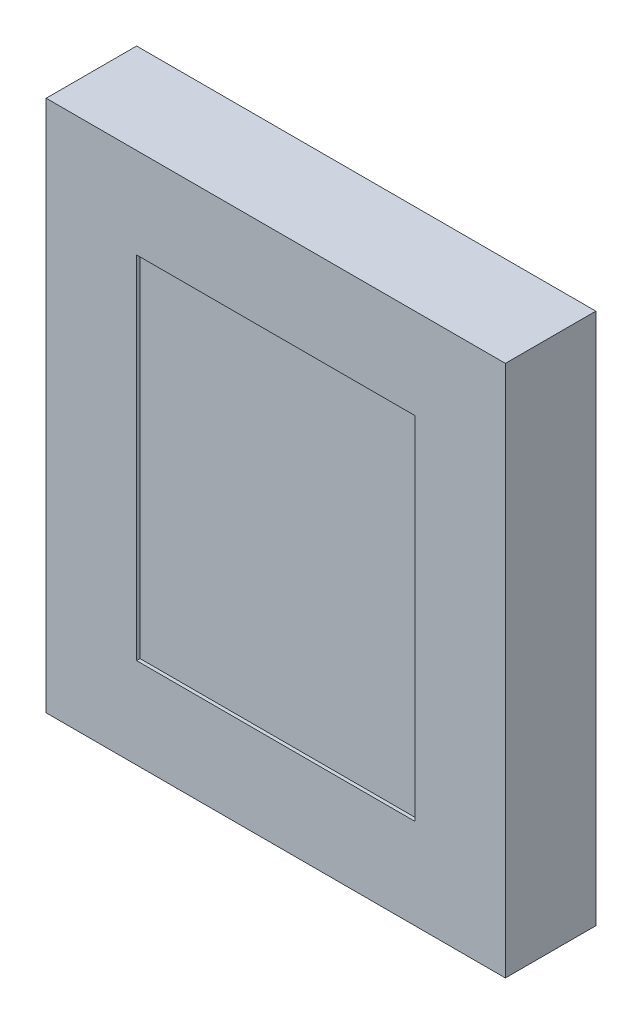
ISO-10303-21;
HEADER;
FILE_DESCRIPTION(('STEP AP214'),'2;1');
FILE_NAME('part.step','',(''),(''),'','','');
FILE_SCHEMA(('AUTOMOTIVE_DESIGN { 1 0 10303 214 1 1 1 1 }'));
ENDSEC;
DATA;
#1=APPLICATION_CONTEXT('core data for automotive mechanical design processes');
#2=APPLICATION_PROTOCOL_DEFINITION('international standard','automotive_design',2000,#1);
#3=PRODUCT_CONTEXT('',#1,'mechanical');
#4=PRODUCT('Part','Part','',(#3));
#5=PRODUCT_RELATED_PRODUCT_CATEGORY('part','',(#4));
#6=PRODUCT_DEFINITION_FORMATION('','',#4);
#7=PRODUCT_DEFINITION_CONTEXT('part definition',#1,'design');
#8=PRODUCT_DEFINITION('design','',#6,#7);
#9=PRODUCT_DEFINITION_SHAPE('','',#8);
#10=(LENGTH_UNIT() NAMED_UNIT(*) SI_UNIT(.MILLI.,.METRE.));
#11=(NAMED_UNIT(*) PLANE_ANGLE_UNIT() SI_UNIT($,.RADIAN.));
#12=(NAMED_UNIT(*) SI_UNIT($,.STERADIAN.) SOLID_ANGLE_UNIT());
#13=UNCERTAINTY_MEASURE_WITH_UNIT(LENGTH_MEASURE(1.E-05),#10,'distance_accuracy_value','');
#14=(GEOMETRIC_REPRESENTATION_CONTEXT(3) GLOBAL_UNCERTAINTY_ASSIGNED_CONTEXT((#13)) GLOBAL_UNIT_ASSIGNED_CONTEXT((#10,
#11,#12)) REPRESENTATION_CONTEXT('',''));
#15=CARTESIAN_POINT('',(0.,0.,0.));
#16=DIRECTION('',(0.,0.,1.));
#17=DIRECTION('',(1.,0.,0.));
#18=AXIS2_PLACEMENT_3D('',#15,#16,#17);
#19=CARTESIAN_POINT('',(330.,382.5,-65.));
#20=DIRECTION('',(0.,1.,0.));
#21=DIRECTION('',(0.,0.,1.));
#22=AXIS2_PLACEMENT_3D('',#19,#20,#21);
#23=PLANE('',#22);
#24=DIRECTION('',(0.,0.,1.));
#25=VECTOR('',#24,1.);
#26=CARTESIAN_POINT('',(-330.,382.5,-65.));
#27=LINE('',#26,#25);
#28=CARTESIAN_POINT('',(-330.,382.5,-65.));
#29=VERTEX_POINT('',#28);
#30=CARTESIAN_POINT('',(-330.,382.5,65.));
#31=VERTEX_POINT('',#30);
#32=EDGE_CURVE('E62',#29,#31,#27,.T.);
#33=ORIENTED_EDGE('',*,*,#32,.T.);
#34=DIRECTION('',(-1.,0.,0.));
#35=VECTOR('',#34,1.);
#36=CARTESIAN_POINT('',(330.,382.5,65.));
#37=LINE('',#36,#35);
#38=CARTESIAN_POINT('',(330.,382.5,65.));
#39=VERTEX_POINT('',#38);
#40=EDGE_CURVE('E160',#39,#31,#37,.T.);
#41=ORIENTED_EDGE('',*,*,#40,.F.);
#42=DIRECTION('',(0.,0.,1.));
#43=VECTOR('',#42,1.);
#44=CARTESIAN_POINT('',(330.,382.5,-65.));
#45=LINE('',#44,#43);
#46=CARTESIAN_POINT('',(330.,382.5,-65.));
#47=VERTEX_POINT('',#46);
#48=EDGE_CURVE('E12',#47,#39,#45,.T.);
#49=ORIENTED_EDGE('',*,*,#48,.F.);
#50=DIRECTION('',(-1.,0.,0.));
#51=VECTOR('',#50,1.);
#52=CARTESIAN_POINT('',(330.,382.5,-65.));
#53=LINE('',#52,#51);
#54=EDGE_CURVE('E188',#47,#29,#53,.T.);
#55=ORIENTED_EDGE('',*,*,#54,.T.);
#56=EDGE_LOOP('',(#33,#41,#49,#55));
#57=FACE_BOUND('',#56,.T.);
#58=ADVANCED_FACE('F59',(#57),#23,.T.);
#59=CARTESIAN_POINT('',(330.,-382.5,-65.));
#60=DIRECTION('',(1.,0.,0.));
#61=DIRECTION('',(0.,1.,0.));
#62=AXIS2_PLACEMENT_3D('',#59,#60,#61);
#63=PLANE('',#62);
#64=ORIENTED_EDGE('',*,*,#48,.T.);
#65=DIRECTION('',(0.,1.,0.));
#66=VECTOR('',#65,1.);
#67=CARTESIAN_POINT('',(330.,-382.5,65.));
#68=LINE('',#67,#66);
#69=CARTESIAN_POINT('',(330.,-382.5,65.));
#70=VERTEX_POINT('',#69);
#71=EDGE_CURVE('E172',#70,#39,#68,.T.);
#72=ORIENTED_EDGE('',*,*,#71,.F.);
#73=DIRECTION('',(0.,0.,1.));
#74=VECTOR('',#73,1.);
#75=CARTESIAN_POINT('',(330.,-382.5,-65.));
#76=LINE('',#75,#74);
#77=CARTESIAN_POINT('',(330.,-382.5,-65.));
#78=VERTEX_POINT('',#77);
#79=EDGE_CURVE('E68',#78,#70,#76,.T.);
#80=ORIENTED_EDGE('',*,*,#79,.F.);
#81=DIRECTION('',(0.,1.,0.));
#82=VECTOR('',#81,1.);
#83=CARTESIAN_POINT('',(330.,-382.5,-65.));
#84=LINE('',#83,#82);
#85=EDGE_CURVE('E204',#78,#47,#84,.T.);
#86=ORIENTED_EDGE('',*,*,#85,.T.);
#87=EDGE_LOOP('',(#64,#72,#80,#86));
#88=FACE_BOUND('',#87,.T.);
#89=ADVANCED_FACE('F220',(#88),#63,.T.);
#90=CARTESIAN_POINT('',(-330.,-382.5,-65.));
#91=DIRECTION('',(0.,-1.,0.));
#92=DIRECTION('',(0.,0.,-1.));
#93=AXIS2_PLACEMENT_3D('',#90,#91,#92);
#94=PLANE('',#93);
#95=ORIENTED_EDGE('',*,*,#79,.T.);
#96=DIRECTION('',(1.,0.,0.));
#97=VECTOR('',#96,1.);
#98=CARTESIAN_POINT('',(-330.,-382.5,65.));
#99=LINE('',#98,#97);
#100=CARTESIAN_POINT('',(-330.,-382.5,65.));
#101=VERTEX_POINT('',#100);
#102=EDGE_CURVE('E168',#101,#70,#99,.T.);
#103=ORIENTED_EDGE('',*,*,#102,.F.);
#104=DIRECTION('',(0.,0.,1.));
#105=VECTOR('',#104,1.);
#106=CARTESIAN_POINT('',(-330.,-382.5,-65.));
#107=LINE('',#106,#105);
#108=CARTESIAN_POINT('',(-330.,-382.5,-65.));
#109=VERTEX_POINT('',#108);
#110=EDGE_CURVE('E209',#109,#101,#107,.T.);
#111=ORIENTED_EDGE('',*,*,#110,.F.);
#112=DIRECTION('',(1.,0.,0.));
#113=VECTOR('',#112,1.);
#114=CARTESIAN_POINT('',(-330.,-382.5,-65.));
#115=LINE('',#114,#113);
#116=EDGE_CURVE('E200',#109,#78,#115,.T.);
#117=ORIENTED_EDGE('',*,*,#116,.T.);
#118=EDGE_LOOP('',(#95,#103,#111,#117));
#119=FACE_BOUND('',#118,.T.);
#120=ADVANCED_FACE('F226',(#119),#94,.T.);
#121=CARTESIAN_POINT('',(-330.,382.5,-65.));
#122=DIRECTION('',(-1.,0.,0.));
#123=DIRECTION('',(0.,-1.,0.));
#124=AXIS2_PLACEMENT_3D('',#121,#122,#123);
#125=PLANE('',#124);
#126=ORIENTED_EDGE('',*,*,#110,.T.);
#127=DIRECTION('',(0.,-1.,0.));
#128=VECTOR('',#127,1.);
#129=CARTESIAN_POINT('',(-330.,382.5,65.));
#130=LINE('',#129,#128);
#131=EDGE_CURVE('E164',#31,#101,#130,.T.);
#132=ORIENTED_EDGE('',*,*,#131,.F.);
#133=ORIENTED_EDGE('',*,*,#32,.F.);
#134=DIRECTION('',(0.,-1.,0.));
#135=VECTOR('',#134,1.);
#136=CARTESIAN_POINT('',(-330.,382.5,-65.));
#137=LINE('',#136,#135);
#138=EDGE_CURVE('E196',#29,#109,#137,.T.);
#139=ORIENTED_EDGE('',*,*,#138,.T.);
#140=EDGE_LOOP('',(#126,#132,#133,#139));
#141=FACE_BOUND('',#140,.T.);
#142=ADVANCED_FACE('F215',(#141),#125,.T.);
#143=CARTESIAN_POINT('',(0.,0.,-65.));
#144=DIRECTION('',(0.,0.,1.));
#145=DIRECTION('',(1.,0.,0.));
#146=AXIS2_PLACEMENT_3D('',#143,#144,#145);
#147=PLANE('',#146);
#148=DIRECTION('',(0.,1.,0.));
#149=VECTOR('',#148,1.);
#150=CARTESIAN_POINT('',(200.,-252.5,-65.));
#151=LINE('',#150,#149);
#152=CARTESIAN_POINT('',(200.,-252.5,-65.));
#153=VERTEX_POINT('',#152);
#154=CARTESIAN_POINT('',(200.,252.5,-65.));
#155=VERTEX_POINT('',#154);
#156=EDGE_CURVE('E138',#153,#155,#151,.T.);
#157=ORIENTED_EDGE('',*,*,#156,.T.);
#158=DIRECTION('',(-1.,0.,0.));
#159=VECTOR('',#158,1.);
#160=CARTESIAN_POINT('',(200.,252.5,-65.));
#161=LINE('',#160,#159);
#162=CARTESIAN_POINT('',(-200.,252.5,-65.));
#163=VERTEX_POINT('',#162);
#164=EDGE_CURVE('E176',#155,#163,#161,.T.);
#165=ORIENTED_EDGE('',*,*,#164,.T.);
#166=DIRECTION('',(0.,-1.,0.));
#167=VECTOR('',#166,1.);
#168=CARTESIAN_POINT('',(-200.,252.5,-65.));
#169=LINE('',#168,#167);
#170=CARTESIAN_POINT('',(-200.,-252.5,-65.));
#171=VERTEX_POINT('',#170);
#172=EDGE_CURVE('E132',#163,#171,#169,.T.);
#173=ORIENTED_EDGE('',*,*,#172,.T.);
#174=DIRECTION('',(1.,0.,0.));
#175=VECTOR('',#174,1.);
#176=CARTESIAN_POINT('',(-200.,-252.5,-65.));
#177=LINE('',#176,#175);
#178=EDGE_CURVE('E76',#171,#153,#177,.T.);
#179=ORIENTED_EDGE('',*,*,#178,.T.);
#180=EDGE_LOOP('',(#157,#165,#173,#179));
#181=FACE_BOUND('',#180,.T.);
#182=ORIENTED_EDGE('',*,*,#54,.F.);
#183=ORIENTED_EDGE('',*,*,#85,.F.);
#184=ORIENTED_EDGE('',*,*,#116,.F.);
#185=ORIENTED_EDGE('',*,*,#138,.F.);
#186=EDGE_LOOP('',(#182,#183,#184,#185));
#187=FACE_BOUND('',#186,.T.);
#188=ADVANCED_FACE('F224',(#181,#187),#147,.F.);
#189=CARTESIAN_POINT('',(200.,252.5,-65.));
#190=DIRECTION('',(0.,1.,0.));
#191=DIRECTION('',(0.,0.,1.));
#192=AXIS2_PLACEMENT_3D('',#189,#190,#191);
#193=PLANE('',#192);
#194=DIRECTION('',(0.,0.,1.));
#195=VECTOR('',#194,1.);
#196=CARTESIAN_POINT('',(200.,252.5,-65.));
#197=LINE('',#196,#195);
#198=CARTESIAN_POINT('',(200.,252.5,65.));
#199=VERTEX_POINT('',#198);
#200=EDGE_CURVE('E143',#155,#199,#197,.T.);
#201=ORIENTED_EDGE('',*,*,#200,.T.);
#202=DIRECTION('',(-1.,0.,0.));
#203=VECTOR('',#202,1.);
#204=CARTESIAN_POINT('',(200.,252.5,65.));
#205=LINE('',#204,#203);
#206=CARTESIAN_POINT('',(-200.,252.5,65.));
#207=VERTEX_POINT('',#206);
#208=EDGE_CURVE('E141',#199,#207,#205,.T.);
#209=ORIENTED_EDGE('',*,*,#208,.T.);
#210=DIRECTION('',(0.,0.,1.));
#211=VECTOR('',#210,1.);
#212=CARTESIAN_POINT('',(-200.,252.5,-65.));
#213=LINE('',#212,#211);
#214=EDGE_CURVE('E125',#163,#207,#213,.T.);
#215=ORIENTED_EDGE('',*,*,#214,.F.);
#216=ORIENTED_EDGE('',*,*,#164,.F.);
#217=EDGE_LOOP('',(#201,#209,#215,#216));
#218=FACE_BOUND('',#217,.T.);
#219=ADVANCED_FACE('F142',(#218),#193,.F.);
#220=CARTESIAN_POINT('',(200.,-252.5,-65.));
#221=DIRECTION('',(1.,0.,0.));
#222=DIRECTION('',(0.,1.,0.));
#223=AXIS2_PLACEMENT_3D('',#220,#221,#222);
#224=PLANE('',#223);
#225=DIRECTION('',(0.,0.,1.));
#226=VECTOR('',#225,1.);
#227=CARTESIAN_POINT('',(200.,-252.5,-65.));
#228=LINE('',#227,#226);
#229=CARTESIAN_POINT('',(200.,-252.5,65.));
#230=VERTEX_POINT('',#229);
#231=EDGE_CURVE('E189',#153,#230,#228,.T.);
#232=ORIENTED_EDGE('',*,*,#231,.T.);
#233=DIRECTION('',(0.,1.,0.));
#234=VECTOR('',#233,1.);
#235=CARTESIAN_POINT('',(200.,-252.5,65.));
#236=LINE('',#235,#234);
#237=EDGE_CURVE('E155',#230,#199,#236,.T.);
#238=ORIENTED_EDGE('',*,*,#237,.T.);
#239=ORIENTED_EDGE('',*,*,#200,.F.);
#240=ORIENTED_EDGE('',*,*,#156,.F.);
#241=EDGE_LOOP('',(#232,#238,#239,#240));
#242=FACE_BOUND('',#241,.T.);
#243=ADVANCED_FACE('F269',(#242),#224,.F.);
#244=CARTESIAN_POINT('',(-200.,-252.5,-65.));
#245=DIRECTION('',(0.,-1.,0.));
#246=DIRECTION('',(0.,0.,-1.));
#247=AXIS2_PLACEMENT_3D('',#244,#245,#246);
#248=PLANE('',#247);
#249=DIRECTION('',(0.,0.,1.));
#250=VECTOR('',#249,1.);
#251=CARTESIAN_POINT('',(-200.,-252.5,-65.));
#252=LINE('',#251,#250);
#253=CARTESIAN_POINT('',(-200.,-252.5,65.));
#254=VERTEX_POINT('',#253);
#255=EDGE_CURVE('E137',#171,#254,#252,.T.);
#256=ORIENTED_EDGE('',*,*,#255,.T.);
#257=DIRECTION('',(1.,0.,0.));
#258=VECTOR('',#257,1.);
#259=CARTESIAN_POINT('',(-200.,-252.5,65.));
#260=LINE('',#259,#258);
#261=EDGE_CURVE('E151',#254,#230,#260,.T.);
#262=ORIENTED_EDGE('',*,*,#261,.T.);
#263=ORIENTED_EDGE('',*,*,#231,.F.);
#264=ORIENTED_EDGE('',*,*,#178,.F.);
#265=EDGE_LOOP('',(#256,#262,#263,#264));
#266=FACE_BOUND('',#265,.T.);
#267=ADVANCED_FACE('F278',(#266),#248,.F.);
#268=CARTESIAN_POINT('',(-200.,252.5,-65.));
#269=DIRECTION('',(-1.,0.,0.));
#270=DIRECTION('',(0.,-1.,0.));
#271=AXIS2_PLACEMENT_3D('',#268,#269,#270);
#272=PLANE('',#271);
#273=ORIENTED_EDGE('',*,*,#214,.T.);
#274=DIRECTION('',(0.,-1.,0.));
#275=VECTOR('',#274,1.);
#276=CARTESIAN_POINT('',(-200.,252.5,65.));
#277=LINE('',#276,#275);
#278=EDGE_CURVE('E129',#207,#254,#277,.T.);
#279=ORIENTED_EDGE('',*,*,#278,.T.);
#280=ORIENTED_EDGE('',*,*,#255,.F.);
#281=ORIENTED_EDGE('',*,*,#172,.F.);
#282=EDGE_LOOP('',(#273,#279,#280,#281));
#283=FACE_BOUND('',#282,.T.);
#284=ADVANCED_FACE('F127',(#283),#272,.F.);
#285=CARTESIAN_POINT('',(0.,0.,65.));
#286=DIRECTION('',(0.,0.,1.));
#287=DIRECTION('',(1.,0.,0.));
#288=AXIS2_PLACEMENT_3D('',#285,#286,#287);
#289=PLANE('',#288);
#290=ORIENTED_EDGE('',*,*,#40,.T.);
#291=ORIENTED_EDGE('',*,*,#131,.T.);
#292=ORIENTED_EDGE('',*,*,#102,.T.);
#293=ORIENTED_EDGE('',*,*,#71,.T.);
#294=EDGE_LOOP('',(#290,#291,#292,#293));
#295=FACE_BOUND('',#294,.T.);
#296=ORIENTED_EDGE('',*,*,#278,.F.);
#297=ORIENTED_EDGE('',*,*,#208,.F.);
#298=ORIENTED_EDGE('',*,*,#237,.F.);
#299=ORIENTED_EDGE('',*,*,#261,.F.);
#300=EDGE_LOOP('',(#296,#297,#298,#299));
#301=FACE_BOUND('',#300,.T.);
#302=ADVANCED_FACE('F149',(#295,#301),#289,.T.);
#303=CLOSED_SHELL('',(#58,#89,#120,#142,#188,#219,#243,#267,#284,#302));
#304=MANIFOLD_SOLID_BREP('B2',#303);
#305=CARTESIAN_POINT('',(-200.,252.5,-60.));
#306=DIRECTION('',(-1.,0.,0.));
#307=DIRECTION('',(0.,-1.,0.));
#308=AXIS2_PLACEMENT_3D('',#305,#306,#307);
#309=PLANE('',#308);
#310=DIRECTION('',(0.,0.,1.));
#311=VECTOR('',#310,1.);
#312=CARTESIAN_POINT('',(-200.,-252.5,-60.));
#313=LINE('',#312,#311);
#314=CARTESIAN_POINT('',(-200.,-252.5,-60.));
#315=VERTEX_POINT('',#314);
#316=CARTESIAN_POINT('',(-200.,-252.5,60.));
#317=VERTEX_POINT('',#316);
#318=EDGE_CURVE('E356',#315,#317,#313,.T.);
#319=ORIENTED_EDGE('',*,*,#318,.T.);
#320=DIRECTION('',(0.,-1.,0.));
#321=VECTOR('',#320,1.);
#322=CARTESIAN_POINT('',(-200.,252.5,60.));
#323=LINE('',#322,#321);
#324=CARTESIAN_POINT('',(-200.,252.5,60.));
#325=VERTEX_POINT('',#324);
#326=EDGE_CURVE('E393',#325,#317,#323,.T.);
#327=ORIENTED_EDGE('',*,*,#326,.F.);
#328=DIRECTION('',(0.,0.,1.));
#329=VECTOR('',#328,1.);
#330=CARTESIAN_POINT('',(-200.,252.5,-60.));
#331=LINE('',#330,#329);
#332=CARTESIAN_POINT('',(-200.,252.5,-60.));
#333=VERTEX_POINT('',#332);
#334=EDGE_CURVE('E57',#333,#325,#331,.T.);
#335=ORIENTED_EDGE('',*,*,#334,.F.);
#336=DIRECTION('',(0.,-1.,0.));
#337=VECTOR('',#336,1.);
#338=CARTESIAN_POINT('',(-200.,252.5,-60.));
#339=LINE('',#338,#337);
#340=EDGE_CURVE('E394',#333,#315,#339,.T.);
#341=ORIENTED_EDGE('',*,*,#340,.T.);
#342=EDGE_LOOP('',(#319,#327,#335,#341));
#343=FACE_BOUND('',#342,.T.);
#344=ADVANCED_FACE('F353',(#343),#309,.T.);
#345=CARTESIAN_POINT('',(200.,252.5,-60.));
#346=DIRECTION('',(0.,1.,0.));
#347=DIRECTION('',(0.,0.,1.));
#348=AXIS2_PLACEMENT_3D('',#345,#346,#347);
#349=PLANE('',#348);
#350=ORIENTED_EDGE('',*,*,#334,.T.);
#351=DIRECTION('',(-1.,0.,0.));
#352=VECTOR('',#351,1.);
#353=CARTESIAN_POINT('',(200.,252.5,60.));
#354=LINE('',#353,#352);
#355=CARTESIAN_POINT('',(200.,252.5,60.));
#356=VERTEX_POINT('',#355);
#357=EDGE_CURVE('E410',#356,#325,#354,.T.);
#358=ORIENTED_EDGE('',*,*,#357,.F.);
#359=DIRECTION('',(0.,0.,1.));
#360=VECTOR('',#359,1.);
#361=CARTESIAN_POINT('',(200.,252.5,-60.));
#362=LINE('',#361,#360);
#363=CARTESIAN_POINT('',(200.,252.5,-60.));
#364=VERTEX_POINT('',#363);
#365=EDGE_CURVE('E361',#364,#356,#362,.T.);
#366=ORIENTED_EDGE('',*,*,#365,.F.);
#367=DIRECTION('',(-1.,0.,0.));
#368=VECTOR('',#367,1.);
#369=CARTESIAN_POINT('',(200.,252.5,-60.));
#370=LINE('',#369,#368);
#371=EDGE_CURVE('E399',#364,#333,#370,.T.);
#372=ORIENTED_EDGE('',*,*,#371,.T.);
#373=EDGE_LOOP('',(#350,#358,#366,#372));
#374=FACE_BOUND('',#373,.T.);
#375=ADVANCED_FACE('F425',(#374),#349,.T.);
#376=CARTESIAN_POINT('',(200.,252.5,-60.));
#377=DIRECTION('',(1.,0.,0.));
#378=DIRECTION('',(0.,1.,0.));
#379=AXIS2_PLACEMENT_3D('',#376,#377,#378);
#380=PLANE('',#379);
#381=ORIENTED_EDGE('',*,*,#365,.T.);
#382=DIRECTION('',(0.,1.,0.));
#383=VECTOR('',#382,1.);
#384=CARTESIAN_POINT('',(200.,252.5,60.));
#385=LINE('',#384,#383);
#386=CARTESIAN_POINT('',(200.,-252.5,60.));
#387=VERTEX_POINT('',#386);
#388=EDGE_CURVE('E406',#387,#356,#385,.T.);
#389=ORIENTED_EDGE('',*,*,#388,.F.);
#390=DIRECTION('',(0.,0.,1.));
#391=VECTOR('',#390,1.);
#392=CARTESIAN_POINT('',(200.,-252.5,-60.));
#393=LINE('',#392,#391);
#394=CARTESIAN_POINT('',(200.,-252.5,-60.));
#395=VERTEX_POINT('',#394);
#396=EDGE_CURVE('E398',#395,#387,#393,.T.);
#397=ORIENTED_EDGE('',*,*,#396,.F.);
#398=DIRECTION('',(0.,1.,0.));
#399=VECTOR('',#398,1.);
#400=CARTESIAN_POINT('',(200.,252.5,-60.));
#401=LINE('',#400,#399);
#402=EDGE_CURVE('E418',#395,#364,#401,.T.);
#403=ORIENTED_EDGE('',*,*,#402,.T.);
#404=EDGE_LOOP('',(#381,#389,#397,#403));
#405=FACE_BOUND('',#404,.T.);
#406=ADVANCED_FACE('F422',(#405),#380,.T.);
#407=CARTESIAN_POINT('',(200.,-252.5,-60.));
#408=DIRECTION('',(0.,-1.,0.));
#409=DIRECTION('',(0.,0.,-1.));
#410=AXIS2_PLACEMENT_3D('',#407,#408,#409);
#411=PLANE('',#410);
#412=ORIENTED_EDGE('',*,*,#396,.T.);
#413=DIRECTION('',(1.,0.,0.));
#414=VECTOR('',#413,1.);
#415=CARTESIAN_POINT('',(200.,-252.5,60.));
#416=LINE('',#415,#414);
#417=EDGE_CURVE('E401',#317,#387,#416,.T.);
#418=ORIENTED_EDGE('',*,*,#417,.F.);
#419=ORIENTED_EDGE('',*,*,#318,.F.);
#420=DIRECTION('',(1.,0.,0.));
#421=VECTOR('',#420,1.);
#422=CARTESIAN_POINT('',(200.,-252.5,-60.));
#423=LINE('',#422,#421);
#424=EDGE_CURVE('E416',#315,#395,#423,.T.);
#425=ORIENTED_EDGE('',*,*,#424,.T.);
#426=EDGE_LOOP('',(#412,#418,#419,#425));
#427=FACE_BOUND('',#426,.T.);
#428=ADVANCED_FACE('F402',(#427),#411,.T.);
#429=CARTESIAN_POINT('',(0.,0.,-60.));
#430=DIRECTION('',(0.,0.,-1.));
#431=DIRECTION('',(-1.,0.,0.));
#432=AXIS2_PLACEMENT_3D('',#429,#430,#431);
#433=PLANE('',#432);
#434=ORIENTED_EDGE('',*,*,#340,.F.);
#435=ORIENTED_EDGE('',*,*,#371,.F.);
#436=ORIENTED_EDGE('',*,*,#402,.F.);
#437=ORIENTED_EDGE('',*,*,#424,.F.);
#438=EDGE_LOOP('',(#434,#435,#436,#437));
#439=FACE_BOUND('',#438,.T.);
#440=ADVANCED_FACE('F427',(#439),#433,.T.);
#441=CARTESIAN_POINT('',(0.,0.,60.));
#442=DIRECTION('',(0.,0.,-1.));
#443=DIRECTION('',(-1.,0.,0.));
#444=AXIS2_PLACEMENT_3D('',#441,#442,#443);
#445=PLANE('',#444);
#446=ORIENTED_EDGE('',*,*,#326,.T.);
#447=ORIENTED_EDGE('',*,*,#417,.T.);
#448=ORIENTED_EDGE('',*,*,#388,.T.);
#449=ORIENTED_EDGE('',*,*,#357,.T.);
#450=EDGE_LOOP('',(#446,#447,#448,#449));
#451=FACE_BOUND('',#450,.T.);
#452=ADVANCED_FACE('F409',(#451),#445,.F.);
#453=CLOSED_SHELL('',(#344,#375,#406,#428,#440,#452));
#454=MANIFOLD_SOLID_BREP('B6',#453);
#455=ADVANCED_BREP_SHAPE_REPRESENTATION('',(#18,#304,#454),#14);
#456=SHAPE_DEFINITION_REPRESENTATION(#9,#455);
ENDSEC;
END-ISO-10303-21;
